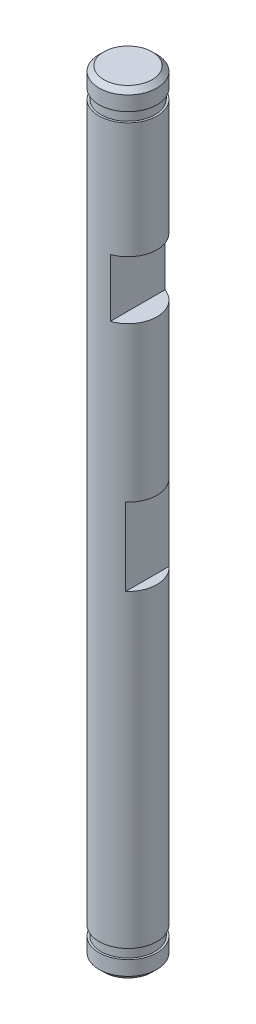
ISO-10303-21;
HEADER;
FILE_DESCRIPTION(('STEP AP214'),'2;1');
FILE_NAME('part.step','',(''),(''),'','','');
FILE_SCHEMA(('AUTOMOTIVE_DESIGN { 1 0 10303 214 1 1 1 1 }'));
ENDSEC;
DATA;
#1=APPLICATION_CONTEXT('core data for automotive mechanical design processes');
#2=APPLICATION_PROTOCOL_DEFINITION('international standard','automotive_design',2000,#1);
#3=PRODUCT_CONTEXT('',#1,'mechanical');
#4=PRODUCT('Part','Part','',(#3));
#5=PRODUCT_RELATED_PRODUCT_CATEGORY('part','',(#4));
#6=PRODUCT_DEFINITION_FORMATION('','',#4);
#7=PRODUCT_DEFINITION_CONTEXT('part definition',#1,'design');
#8=PRODUCT_DEFINITION('design','',#6,#7);
#9=PRODUCT_DEFINITION_SHAPE('','',#8);
#10=(LENGTH_UNIT() NAMED_UNIT(*) SI_UNIT(.MILLI.,.METRE.));
#11=(NAMED_UNIT(*) PLANE_ANGLE_UNIT() SI_UNIT($,.RADIAN.));
#12=(NAMED_UNIT(*) SI_UNIT($,.STERADIAN.) SOLID_ANGLE_UNIT());
#13=UNCERTAINTY_MEASURE_WITH_UNIT(LENGTH_MEASURE(1.E-05),#10,'distance_accuracy_value','');
#14=(GEOMETRIC_REPRESENTATION_CONTEXT(3) GLOBAL_UNCERTAINTY_ASSIGNED_CONTEXT((#13)) GLOBAL_UNIT_ASSIGNED_CONTEXT((#10,
#11,#12)) REPRESENTATION_CONTEXT('',''));
#15=CARTESIAN_POINT('',(0.,0.,0.));
#16=DIRECTION('',(0.,0.,1.));
#17=DIRECTION('',(1.,0.,0.));
#18=AXIS2_PLACEMENT_3D('',#15,#16,#17);
#19=CARTESIAN_POINT('',(0.,80.,0.));
#20=DIRECTION('',(0.,-1.,0.));
#21=DIRECTION('',(0.,0.,-1.));
#22=AXIS2_PLACEMENT_3D('',#19,#20,#21);
#23=CYLINDRICAL_SURFACE('',#22,3.);
#24=CARTESIAN_POINT('',(0.,35.,0.));
#25=DIRECTION('',(0.,1.,0.));
#26=DIRECTION('',(0.,0.,1.));
#27=AXIS2_PLACEMENT_3D('',#24,#25,#26);
#28=CIRCLE('',#27,3.);
#29=CARTESIAN_POINT('',(2.,35.,-2.23606797749979));
#30=VERTEX_POINT('',#29);
#31=CARTESIAN_POINT('',(2.,35.,2.23606797749979));
#32=VERTEX_POINT('',#31);
#33=EDGE_CURVE('E118',#30,#32,#28,.F.);
#34=ORIENTED_EDGE('',*,*,#33,.T.);
#35=DIRECTION('',(0.,-1.,0.));
#36=VECTOR('',#35,1.);
#37=CARTESIAN_POINT('',(2.,80.,2.23606797749979));
#38=LINE('',#37,#36);
#39=CARTESIAN_POINT('',(2.,43.,2.23606797749979));
#40=VERTEX_POINT('',#39);
#41=EDGE_CURVE('E109',#32,#40,#38,.F.);
#42=ORIENTED_EDGE('',*,*,#41,.T.);
#43=CARTESIAN_POINT('',(0.,43.,0.));
#44=DIRECTION('',(0.,1.,0.));
#45=DIRECTION('',(0.,0.,1.));
#46=AXIS2_PLACEMENT_3D('',#43,#44,#45);
#47=CIRCLE('',#46,3.);
#48=CARTESIAN_POINT('',(2.,43.,-2.23606797749979));
#49=VERTEX_POINT('',#48);
#50=EDGE_CURVE('E112',#49,#40,#47,.F.);
#51=ORIENTED_EDGE('',*,*,#50,.F.);
#52=DIRECTION('',(0.,-1.,0.));
#53=VECTOR('',#52,1.);
#54=CARTESIAN_POINT('',(2.,80.,-2.23606797749979));
#55=LINE('',#54,#53);
#56=EDGE_CURVE('E103',#49,#30,#55,.T.);
#57=ORIENTED_EDGE('',*,*,#56,.T.);
#58=EDGE_LOOP('',(#34,#42,#51,#57));
#59=FACE_BOUND('',#58,.T.);
#60=CARTESIAN_POINT('',(0.,77.,0.));
#61=DIRECTION('',(0.,1.,0.));
#62=DIRECTION('',(0.,0.,1.));
#63=AXIS2_PLACEMENT_3D('',#60,#61,#62);
#64=CIRCLE('',#63,3.);
#65=CARTESIAN_POINT('',(0.,77.,3.));
#66=VERTEX_POINT('',#65);
#67=EDGE_CURVE('E198',#66,#66,#64,.T.);
#68=ORIENTED_EDGE('',*,*,#67,.F.);
#69=EDGE_LOOP('',(#68));
#70=FACE_BOUND('',#69,.T.);
#71=CARTESIAN_POINT('',(0.,3.,0.));
#72=DIRECTION('',(0.,-1.,0.));
#73=DIRECTION('',(0.,0.,-1.));
#74=AXIS2_PLACEMENT_3D('',#71,#72,#73);
#75=CIRCLE('',#74,3.);
#76=CARTESIAN_POINT('',(0.,3.,-3.));
#77=VERTEX_POINT('',#76);
#78=EDGE_CURVE('E179',#77,#77,#75,.T.);
#79=ORIENTED_EDGE('',*,*,#78,.F.);
#80=EDGE_LOOP('',(#79));
#81=FACE_BOUND('',#80,.T.);
#82=CARTESIAN_POINT('',(0.,59.,0.));
#83=DIRECTION('',(0.,1.,0.));
#84=DIRECTION('',(0.,0.,1.));
#85=AXIS2_PLACEMENT_3D('',#82,#83,#84);
#86=CIRCLE('',#85,3.);
#87=CARTESIAN_POINT('',(1.,59.,-2.82842712474619));
#88=VERTEX_POINT('',#87);
#89=CARTESIAN_POINT('',(1.,59.,2.82842712474619));
#90=VERTEX_POINT('',#89);
#91=EDGE_CURVE('E150',#88,#90,#86,.F.);
#92=ORIENTED_EDGE('',*,*,#91,.T.);
#93=DIRECTION('',(0.,-1.,0.));
#94=VECTOR('',#93,1.);
#95=CARTESIAN_POINT('',(1.,80.,2.82842712474619));
#96=LINE('',#95,#94);
#97=CARTESIAN_POINT('',(1.,65.,2.82842712474619));
#98=VERTEX_POINT('',#97);
#99=EDGE_CURVE('E168',#90,#98,#96,.F.);
#100=ORIENTED_EDGE('',*,*,#99,.T.);
#101=CARTESIAN_POINT('',(0.,65.,0.));
#102=DIRECTION('',(0.,1.,0.));
#103=DIRECTION('',(0.,0.,1.));
#104=AXIS2_PLACEMENT_3D('',#101,#102,#103);
#105=CIRCLE('',#104,3.);
#106=CARTESIAN_POINT('',(1.,65.,-2.82842712474619));
#107=VERTEX_POINT('',#106);
#108=EDGE_CURVE('E155',#107,#98,#105,.F.);
#109=ORIENTED_EDGE('',*,*,#108,.F.);
#110=DIRECTION('',(0.,-1.,0.));
#111=VECTOR('',#110,1.);
#112=CARTESIAN_POINT('',(1.,80.,-2.82842712474619));
#113=LINE('',#112,#111);
#114=EDGE_CURVE('E162',#107,#88,#113,.T.);
#115=ORIENTED_EDGE('',*,*,#114,.T.);
#116=EDGE_LOOP('',(#92,#100,#109,#115));
#117=FACE_BOUND('',#116,.T.);
#118=DIRECTION('',(0.,-1.,0.));
#119=VECTOR('',#118,1.);
#120=CARTESIAN_POINT('',(-2.,80.,2.23606797749979));
#121=LINE('',#120,#119);
#122=CARTESIAN_POINT('',(-2.,35.,2.23606797749979));
#123=VERTEX_POINT('',#122);
#124=CARTESIAN_POINT('',(-2.,43.,2.23606797749979));
#125=VERTEX_POINT('',#124);
#126=EDGE_CURVE('E144',#123,#125,#121,.F.);
#127=ORIENTED_EDGE('',*,*,#126,.F.);
#128=CARTESIAN_POINT('',(0.,35.,0.));
#129=DIRECTION('',(0.,-1.,0.));
#130=DIRECTION('',(0.,0.,-1.));
#131=AXIS2_PLACEMENT_3D('',#128,#129,#130);
#132=CIRCLE('',#131,3.);
#133=CARTESIAN_POINT('',(-2.,35.,-2.23606797749979));
#134=VERTEX_POINT('',#133);
#135=EDGE_CURVE('E127',#134,#123,#132,.F.);
#136=ORIENTED_EDGE('',*,*,#135,.F.);
#137=DIRECTION('',(0.,-1.,0.));
#138=VECTOR('',#137,1.);
#139=CARTESIAN_POINT('',(-2.,80.,-2.23606797749979));
#140=LINE('',#139,#138);
#141=CARTESIAN_POINT('',(-2.,43.,-2.23606797749979));
#142=VERTEX_POINT('',#141);
#143=EDGE_CURVE('E136',#142,#134,#140,.T.);
#144=ORIENTED_EDGE('',*,*,#143,.F.);
#145=CARTESIAN_POINT('',(0.,43.,0.));
#146=DIRECTION('',(0.,-1.,0.));
#147=DIRECTION('',(0.,0.,-1.));
#148=AXIS2_PLACEMENT_3D('',#145,#146,#147);
#149=CIRCLE('',#148,3.);
#150=EDGE_CURVE('E72',#142,#125,#149,.F.);
#151=ORIENTED_EDGE('',*,*,#150,.T.);
#152=EDGE_LOOP('',(#127,#136,#144,#151));
#153=FACE_BOUND('',#152,.T.);
#154=ADVANCED_FACE('F50',(#59,#70,#81,#117,#153),#23,.T.);
#155=CARTESIAN_POINT('',(0.,79.5,0.));
#156=DIRECTION('',(0.,1.,0.));
#157=DIRECTION('',(0.,0.,1.));
#158=AXIS2_PLACEMENT_3D('',#155,#156,#157);
#159=CIRCLE('',#158,3.);
#160=CARTESIAN_POINT('',(0.,79.5,3.));
#161=VERTEX_POINT('',#160);
#162=EDGE_CURVE('E11',#161,#161,#159,.F.);
#163=ORIENTED_EDGE('',*,*,#162,.T.);
#164=EDGE_LOOP('',(#163));
#165=FACE_BOUND('',#164,.T.);
#166=CARTESIAN_POINT('',(0.,78.,0.));
#167=DIRECTION('',(0.,-1.,0.));
#168=DIRECTION('',(0.,0.,-1.));
#169=AXIS2_PLACEMENT_3D('',#166,#167,#168);
#170=CIRCLE('',#169,3.);
#171=CARTESIAN_POINT('',(0.,78.,-3.));
#172=VERTEX_POINT('',#171);
#173=EDGE_CURVE('E193',#172,#172,#170,.T.);
#174=ORIENTED_EDGE('',*,*,#173,.F.);
#175=EDGE_LOOP('',(#174));
#176=FACE_BOUND('',#175,.T.);
#177=ADVANCED_FACE('F224',(#165,#176),#23,.T.);
#178=CARTESIAN_POINT('',(0.,80.,0.));
#179=DIRECTION('',(0.,1.,0.));
#180=DIRECTION('',(0.,0.,1.));
#181=AXIS2_PLACEMENT_3D('',#178,#179,#180);
#182=PLANE('',#181);
#183=CARTESIAN_POINT('',(0.,80.,0.));
#184=DIRECTION('',(0.,1.,0.));
#185=DIRECTION('',(0.,0.,1.));
#186=AXIS2_PLACEMENT_3D('',#183,#184,#185);
#187=CIRCLE('',#186,2.5);
#188=CARTESIAN_POINT('',(0.,80.,2.5));
#189=VERTEX_POINT('',#188);
#190=EDGE_CURVE('E60',#189,#189,#187,.T.);
#191=ORIENTED_EDGE('',*,*,#190,.T.);
#192=EDGE_LOOP('',(#191));
#193=FACE_BOUND('',#192,.T.);
#194=ADVANCED_FACE('F215',(#193),#182,.T.);
#195=CARTESIAN_POINT('',(2.8,77.,0.));
#196=DIRECTION('',(0.,1.,0.));
#197=DIRECTION('',(0.,0.,1.));
#198=AXIS2_PLACEMENT_3D('',#195,#196,#197);
#199=PLANE('',#198);
#200=CARTESIAN_POINT('',(0.,77.,0.));
#201=DIRECTION('',(0.,1.,0.));
#202=DIRECTION('',(0.,0.,1.));
#203=AXIS2_PLACEMENT_3D('',#200,#201,#202);
#204=CIRCLE('',#203,2.8);
#205=CARTESIAN_POINT('',(0.,77.,2.8));
#206=VERTEX_POINT('',#205);
#207=EDGE_CURVE('E174',#206,#206,#204,.T.);
#208=ORIENTED_EDGE('',*,*,#207,.F.);
#209=EDGE_LOOP('',(#208));
#210=FACE_BOUND('',#209,.T.);
#211=ORIENTED_EDGE('',*,*,#67,.T.);
#212=EDGE_LOOP('',(#211));
#213=FACE_BOUND('',#212,.T.);
#214=ADVANCED_FACE('F275',(#210,#213),#199,.T.);
#215=CARTESIAN_POINT('',(2.8,78.,0.));
#216=DIRECTION('',(0.,-1.,0.));
#217=DIRECTION('',(0.,0.,-1.));
#218=AXIS2_PLACEMENT_3D('',#215,#216,#217);
#219=PLANE('',#218);
#220=CARTESIAN_POINT('',(0.,78.,0.));
#221=DIRECTION('',(0.,1.,0.));
#222=DIRECTION('',(0.,0.,1.));
#223=AXIS2_PLACEMENT_3D('',#220,#221,#222);
#224=CIRCLE('',#223,2.8);
#225=CARTESIAN_POINT('',(0.,78.,2.8));
#226=VERTEX_POINT('',#225);
#227=EDGE_CURVE('E171',#226,#226,#224,.T.);
#228=ORIENTED_EDGE('',*,*,#227,.T.);
#229=EDGE_LOOP('',(#228));
#230=FACE_BOUND('',#229,.T.);
#231=ORIENTED_EDGE('',*,*,#173,.T.);
#232=EDGE_LOOP('',(#231));
#233=FACE_BOUND('',#232,.T.);
#234=ADVANCED_FACE('F263',(#230,#233),#219,.T.);
#235=CARTESIAN_POINT('',(0.,80.,0.));
#236=DIRECTION('',(0.,1.,0.));
#237=DIRECTION('',(0.,0.,1.));
#238=AXIS2_PLACEMENT_3D('',#235,#236,#237);
#239=CYLINDRICAL_SURFACE('',#238,2.8);
#240=ORIENTED_EDGE('',*,*,#207,.T.);
#241=EDGE_LOOP('',(#240));
#242=FACE_BOUND('',#241,.T.);
#243=ORIENTED_EDGE('',*,*,#227,.F.);
#244=EDGE_LOOP('',(#243));
#245=FACE_BOUND('',#244,.T.);
#246=ADVANCED_FACE('F251',(#242,#245),#239,.T.);
#247=CARTESIAN_POINT('',(2.8,2.,0.));
#248=DIRECTION('',(0.,1.,0.));
#249=DIRECTION('',(0.,0.,1.));
#250=AXIS2_PLACEMENT_3D('',#247,#248,#249);
#251=PLANE('',#250);
#252=CARTESIAN_POINT('',(0.,2.,0.));
#253=DIRECTION('',(0.,1.,0.));
#254=DIRECTION('',(0.,0.,1.));
#255=AXIS2_PLACEMENT_3D('',#252,#253,#254);
#256=CIRCLE('',#255,2.8);
#257=CARTESIAN_POINT('',(0.,2.,2.8));
#258=VERTEX_POINT('',#257);
#259=EDGE_CURVE('E176',#258,#258,#256,.T.);
#260=ORIENTED_EDGE('',*,*,#259,.F.);
#261=EDGE_LOOP('',(#260));
#262=FACE_BOUND('',#261,.T.);
#263=CARTESIAN_POINT('',(0.,2.,0.));
#264=DIRECTION('',(0.,1.,0.));
#265=DIRECTION('',(0.,0.,1.));
#266=AXIS2_PLACEMENT_3D('',#263,#264,#265);
#267=CIRCLE('',#266,3.);
#268=CARTESIAN_POINT('',(0.,2.,3.));
#269=VERTEX_POINT('',#268);
#270=EDGE_CURVE('E188',#269,#269,#267,.T.);
#271=ORIENTED_EDGE('',*,*,#270,.T.);
#272=EDGE_LOOP('',(#271));
#273=FACE_BOUND('',#272,.T.);
#274=ADVANCED_FACE('F252',(#262,#273),#251,.T.);
#275=CARTESIAN_POINT('',(2.8,3.,0.));
#276=DIRECTION('',(0.,-1.,0.));
#277=DIRECTION('',(0.,0.,-1.));
#278=AXIS2_PLACEMENT_3D('',#275,#276,#277);
#279=PLANE('',#278);
#280=CARTESIAN_POINT('',(0.,3.,0.));
#281=DIRECTION('',(0.,1.,0.));
#282=DIRECTION('',(0.,0.,1.));
#283=AXIS2_PLACEMENT_3D('',#280,#281,#282);
#284=CIRCLE('',#283,2.8);
#285=CARTESIAN_POINT('',(0.,3.,2.8));
#286=VERTEX_POINT('',#285);
#287=EDGE_CURVE('E167',#286,#286,#284,.T.);
#288=ORIENTED_EDGE('',*,*,#287,.T.);
#289=EDGE_LOOP('',(#288));
#290=FACE_BOUND('',#289,.T.);
#291=ORIENTED_EDGE('',*,*,#78,.T.);
#292=EDGE_LOOP('',(#291));
#293=FACE_BOUND('',#292,.T.);
#294=ADVANCED_FACE('F254',(#290,#293),#279,.T.);
#295=CARTESIAN_POINT('',(0.,80.,0.));
#296=DIRECTION('',(0.,1.,0.));
#297=DIRECTION('',(0.,0.,1.));
#298=AXIS2_PLACEMENT_3D('',#295,#296,#297);
#299=CYLINDRICAL_SURFACE('',#298,2.8);
#300=ORIENTED_EDGE('',*,*,#259,.T.);
#301=EDGE_LOOP('',(#300));
#302=FACE_BOUND('',#301,.T.);
#303=ORIENTED_EDGE('',*,*,#287,.F.);
#304=EDGE_LOOP('',(#303));
#305=FACE_BOUND('',#304,.T.);
#306=ADVANCED_FACE('F244',(#302,#305),#299,.T.);
#307=CARTESIAN_POINT('',(0.,0.,0.));
#308=DIRECTION('',(0.,1.,0.));
#309=DIRECTION('',(0.,0.,1.));
#310=AXIS2_PLACEMENT_3D('',#307,#308,#309);
#311=PLANE('',#310);
#312=CARTESIAN_POINT('',(0.,0.,0.));
#313=DIRECTION('',(0.,1.,0.));
#314=DIRECTION('',(0.,0.,1.));
#315=AXIS2_PLACEMENT_3D('',#312,#313,#314);
#316=CIRCLE('',#315,2.5);
#317=CARTESIAN_POINT('',(0.,0.,2.5));
#318=VERTEX_POINT('',#317);
#319=EDGE_CURVE('E207',#318,#318,#316,.F.);
#320=ORIENTED_EDGE('',*,*,#319,.T.);
#321=EDGE_LOOP('',(#320));
#322=FACE_BOUND('',#321,.T.);
#323=ADVANCED_FACE('F236',(#322),#311,.F.);
#324=CARTESIAN_POINT('',(0.,0.5,0.));
#325=DIRECTION('',(0.,1.,0.));
#326=DIRECTION('',(0.,0.,1.));
#327=AXIS2_PLACEMENT_3D('',#324,#325,#326);
#328=CIRCLE('',#327,3.);
#329=CARTESIAN_POINT('',(0.,0.5,3.));
#330=VERTEX_POINT('',#329);
#331=EDGE_CURVE('E205',#330,#330,#328,.T.);
#332=ORIENTED_EDGE('',*,*,#331,.T.);
#333=EDGE_LOOP('',(#332));
#334=FACE_BOUND('',#333,.T.);
#335=ORIENTED_EDGE('',*,*,#270,.F.);
#336=EDGE_LOOP('',(#335));
#337=FACE_BOUND('',#336,.T.);
#338=ADVANCED_FACE('F228',(#334,#337),#23,.T.);
#339=CARTESIAN_POINT('',(3.001,65.,0.));
#340=DIRECTION('',(0.,1.,0.));
#341=DIRECTION('',(0.,0.,1.));
#342=AXIS2_PLACEMENT_3D('',#339,#340,#341);
#343=PLANE('',#342);
#344=ORIENTED_EDGE('',*,*,#108,.T.);
#345=DIRECTION('',(0.,0.,-1.));
#346=VECTOR('',#345,1.);
#347=CARTESIAN_POINT('',(1.,65.,0.));
#348=LINE('',#347,#346);
#349=EDGE_CURVE('E154',#98,#107,#348,.T.);
#350=ORIENTED_EDGE('',*,*,#349,.T.);
#351=EDGE_LOOP('',(#344,#350));
#352=FACE_BOUND('',#351,.T.);
#353=ADVANCED_FACE('F232',(#352),#343,.F.);
#354=CARTESIAN_POINT('',(3.001,59.,0.));
#355=DIRECTION('',(0.,1.,0.));
#356=DIRECTION('',(0.,0.,1.));
#357=AXIS2_PLACEMENT_3D('',#354,#355,#356);
#358=PLANE('',#357);
#359=DIRECTION('',(0.,0.,-1.));
#360=VECTOR('',#359,1.);
#361=CARTESIAN_POINT('',(1.,59.,0.));
#362=LINE('',#361,#360);
#363=EDGE_CURVE('E159',#90,#88,#362,.T.);
#364=ORIENTED_EDGE('',*,*,#363,.F.);
#365=ORIENTED_EDGE('',*,*,#91,.F.);
#366=EDGE_LOOP('',(#364,#365));
#367=FACE_BOUND('',#366,.T.);
#368=ADVANCED_FACE('F245',(#367),#358,.T.);
#369=CARTESIAN_POINT('',(1.,0.,0.));
#370=DIRECTION('',(1.,0.,0.));
#371=DIRECTION('',(0.,0.,-1.));
#372=AXIS2_PLACEMENT_3D('',#369,#370,#371);
#373=PLANE('',#372);
#374=ORIENTED_EDGE('',*,*,#363,.T.);
#375=ORIENTED_EDGE('',*,*,#114,.F.);
#376=ORIENTED_EDGE('',*,*,#349,.F.);
#377=ORIENTED_EDGE('',*,*,#99,.F.);
#378=EDGE_LOOP('',(#374,#375,#376,#377));
#379=FACE_BOUND('',#378,.T.);
#380=ADVANCED_FACE('F288',(#379),#373,.T.);
#381=CARTESIAN_POINT('',(-3.001,35.,0.));
#382=DIRECTION('',(0.,-1.,0.));
#383=DIRECTION('',(0.,0.,-1.));
#384=AXIS2_PLACEMENT_3D('',#381,#382,#383);
#385=PLANE('',#384);
#386=ORIENTED_EDGE('',*,*,#135,.T.);
#387=DIRECTION('',(0.,0.,-1.));
#388=VECTOR('',#387,1.);
#389=CARTESIAN_POINT('',(-2.,35.,0.));
#390=LINE('',#389,#388);
#391=EDGE_CURVE('E140',#123,#134,#390,.T.);
#392=ORIENTED_EDGE('',*,*,#391,.T.);
#393=EDGE_LOOP('',(#386,#392));
#394=FACE_BOUND('',#393,.T.);
#395=ADVANCED_FACE('F292',(#394),#385,.F.);
#396=CARTESIAN_POINT('',(-3.001,43.,0.));
#397=DIRECTION('',(0.,-1.,0.));
#398=DIRECTION('',(0.,0.,-1.));
#399=AXIS2_PLACEMENT_3D('',#396,#397,#398);
#400=PLANE('',#399);
#401=DIRECTION('',(0.,0.,-1.));
#402=VECTOR('',#401,1.);
#403=CARTESIAN_POINT('',(-2.,43.,0.));
#404=LINE('',#403,#402);
#405=EDGE_CURVE('E132',#125,#142,#404,.T.);
#406=ORIENTED_EDGE('',*,*,#405,.F.);
#407=ORIENTED_EDGE('',*,*,#150,.F.);
#408=EDGE_LOOP('',(#406,#407));
#409=FACE_BOUND('',#408,.T.);
#410=ADVANCED_FACE('F295',(#409),#400,.T.);
#411=CARTESIAN_POINT('',(-2.,0.,0.));
#412=DIRECTION('',(1.,0.,0.));
#413=DIRECTION('',(0.,0.,-1.));
#414=AXIS2_PLACEMENT_3D('',#411,#412,#413);
#415=PLANE('',#414);
#416=ORIENTED_EDGE('',*,*,#126,.T.);
#417=ORIENTED_EDGE('',*,*,#405,.T.);
#418=ORIENTED_EDGE('',*,*,#143,.T.);
#419=ORIENTED_EDGE('',*,*,#391,.F.);
#420=EDGE_LOOP('',(#416,#417,#418,#419));
#421=FACE_BOUND('',#420,.T.);
#422=ADVANCED_FACE('F300',(#421),#415,.F.);
#423=CARTESIAN_POINT('',(3.001,43.,0.));
#424=DIRECTION('',(0.,1.,0.));
#425=DIRECTION('',(0.,0.,1.));
#426=AXIS2_PLACEMENT_3D('',#423,#424,#425);
#427=PLANE('',#426);
#428=ORIENTED_EDGE('',*,*,#50,.T.);
#429=DIRECTION('',(0.,0.,-1.));
#430=VECTOR('',#429,1.);
#431=CARTESIAN_POINT('',(2.,43.,0.));
#432=LINE('',#431,#430);
#433=EDGE_CURVE('E104',#40,#49,#432,.T.);
#434=ORIENTED_EDGE('',*,*,#433,.T.);
#435=EDGE_LOOP('',(#428,#434));
#436=FACE_BOUND('',#435,.T.);
#437=ADVANCED_FACE('F113',(#436),#427,.F.);
#438=CARTESIAN_POINT('',(3.001,35.,0.));
#439=DIRECTION('',(0.,1.,0.));
#440=DIRECTION('',(0.,0.,1.));
#441=AXIS2_PLACEMENT_3D('',#438,#439,#440);
#442=PLANE('',#441);
#443=DIRECTION('',(0.,0.,-1.));
#444=VECTOR('',#443,1.);
#445=CARTESIAN_POINT('',(2.,35.,0.));
#446=LINE('',#445,#444);
#447=EDGE_CURVE('E63',#32,#30,#446,.T.);
#448=ORIENTED_EDGE('',*,*,#447,.F.);
#449=ORIENTED_EDGE('',*,*,#33,.F.);
#450=EDGE_LOOP('',(#448,#449));
#451=FACE_BOUND('',#450,.T.);
#452=ADVANCED_FACE('F302',(#451),#442,.T.);
#453=CARTESIAN_POINT('',(2.,0.,0.));
#454=DIRECTION('',(1.,0.,0.));
#455=DIRECTION('',(0.,0.,-1.));
#456=AXIS2_PLACEMENT_3D('',#453,#454,#455);
#457=PLANE('',#456);
#458=ORIENTED_EDGE('',*,*,#447,.T.);
#459=ORIENTED_EDGE('',*,*,#56,.F.);
#460=ORIENTED_EDGE('',*,*,#433,.F.);
#461=ORIENTED_EDGE('',*,*,#41,.F.);
#462=EDGE_LOOP('',(#458,#459,#460,#461));
#463=FACE_BOUND('',#462,.T.);
#464=ADVANCED_FACE('F101',(#463),#457,.T.);
#465=CARTESIAN_POINT('',(0.,0.5,0.));
#466=DIRECTION('',(0.,1.,0.));
#467=DIRECTION('',(0.,0.,1.));
#468=AXIS2_PLACEMENT_3D('',#465,#466,#467);
#469=CONICAL_SURFACE('',#468,3.,0.785398163397446);
#470=ORIENTED_EDGE('',*,*,#319,.F.);
#471=EDGE_LOOP('',(#470));
#472=FACE_BOUND('',#471,.T.);
#473=ORIENTED_EDGE('',*,*,#331,.F.);
#474=EDGE_LOOP('',(#473));
#475=FACE_BOUND('',#474,.T.);
#476=ADVANCED_FACE('F216',(#472,#475),#469,.T.);
#477=CARTESIAN_POINT('',(0.,80.,0.));
#478=DIRECTION('',(0.,-1.,0.));
#479=DIRECTION('',(0.,0.,-1.));
#480=AXIS2_PLACEMENT_3D('',#477,#478,#479);
#481=CONICAL_SURFACE('',#480,2.5,0.785398163397439);
#482=ORIENTED_EDGE('',*,*,#162,.F.);
#483=EDGE_LOOP('',(#482));
#484=FACE_BOUND('',#483,.T.);
#485=ORIENTED_EDGE('',*,*,#190,.F.);
#486=EDGE_LOOP('',(#485));
#487=FACE_BOUND('',#486,.T.);
#488=ADVANCED_FACE('F49',(#484,#487),#481,.T.);
#489=CLOSED_SHELL('',(#154,#177,#194,#214,#234,#246,#274,#294,#306,#323,#338,#353,#368,#380,
#395,#410,#422,#437,#452,#464,#476,#488));
#490=MANIFOLD_SOLID_BREP('B2',#489);
#491=ADVANCED_BREP_SHAPE_REPRESENTATION('',(#18,#490),#14);
#492=SHAPE_DEFINITION_REPRESENTATION(#9,#491);
ENDSEC;
END-ISO-10303-21;
